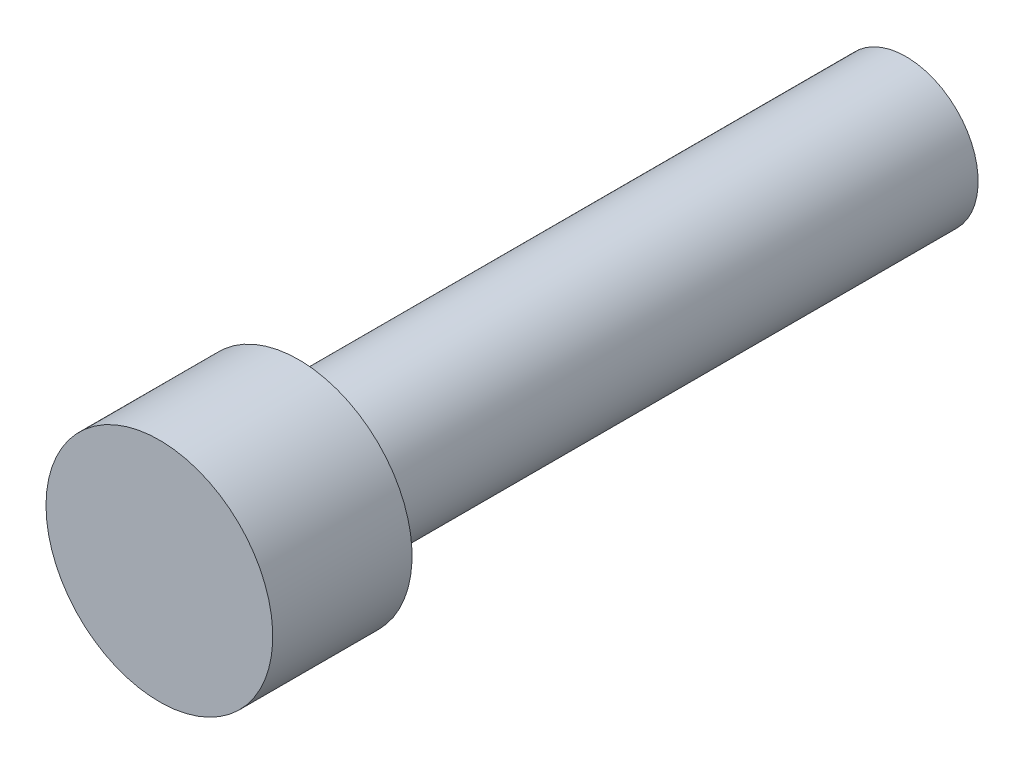
ISO-10303-21;
HEADER;
FILE_DESCRIPTION(('STEP AP214'),'2;1');
FILE_NAME('part.step','',(''),(''),'','','');
FILE_SCHEMA(('AUTOMOTIVE_DESIGN { 1 0 10303 214 1 1 1 1 }'));
ENDSEC;
DATA;
#1=APPLICATION_CONTEXT('core data for automotive mechanical design processes');
#2=APPLICATION_PROTOCOL_DEFINITION('international standard','automotive_design',2000,#1);
#3=PRODUCT_CONTEXT('',#1,'mechanical');
#4=PRODUCT('Part','Part','',(#3));
#5=PRODUCT_RELATED_PRODUCT_CATEGORY('part','',(#4));
#6=PRODUCT_DEFINITION_FORMATION('','',#4);
#7=PRODUCT_DEFINITION_CONTEXT('part definition',#1,'design');
#8=PRODUCT_DEFINITION('design','',#6,#7);
#9=PRODUCT_DEFINITION_SHAPE('','',#8);
#10=(LENGTH_UNIT() NAMED_UNIT(*) SI_UNIT(.MILLI.,.METRE.));
#11=(NAMED_UNIT(*) PLANE_ANGLE_UNIT() SI_UNIT($,.RADIAN.));
#12=(NAMED_UNIT(*) SI_UNIT($,.STERADIAN.) SOLID_ANGLE_UNIT());
#13=UNCERTAINTY_MEASURE_WITH_UNIT(LENGTH_MEASURE(1.E-05),#10,'distance_accuracy_value','');
#14=(GEOMETRIC_REPRESENTATION_CONTEXT(3) GLOBAL_UNCERTAINTY_ASSIGNED_CONTEXT((#13)) GLOBAL_UNIT_ASSIGNED_CONTEXT((#10,
#11,#12)) REPRESENTATION_CONTEXT('',''));
#15=CARTESIAN_POINT('',(0.,0.,0.));
#16=DIRECTION('',(0.,0.,1.));
#17=DIRECTION('',(1.,0.,0.));
#18=AXIS2_PLACEMENT_3D('',#15,#16,#17);
#19=CARTESIAN_POINT('',(0.,0.,11.7094));
#20=DIRECTION('',(0.,0.,-1.));
#21=DIRECTION('',(-1.,0.,0.));
#22=AXIS2_PLACEMENT_3D('',#19,#20,#21);
#23=CYLINDRICAL_SURFACE('',#22,1.778);
#24=CARTESIAN_POINT('',(0.,0.,11.7094));
#25=DIRECTION('',(0.,0.,1.));
#26=DIRECTION('',(1.,0.,0.));
#27=AXIS2_PLACEMENT_3D('',#24,#25,#26);
#28=CIRCLE('',#27,1.778);
#29=CARTESIAN_POINT('',(-1.778,0.,11.7094));
#30=VERTEX_POINT('',#29);
#31=EDGE_CURVE('E11',#30,#30,#28,.T.);
#32=CARTESIAN_POINT('',(0.,0.,9.525));
#33=DIRECTION('',(0.,0.,-1.));
#34=DIRECTION('',(-1.,0.,0.));
#35=AXIS2_PLACEMENT_3D('',#32,#33,#34);
#36=CIRCLE('',#35,1.778);
#37=CARTESIAN_POINT('',(-1.778,0.,9.525));
#38=VERTEX_POINT('',#37);
#39=EDGE_CURVE('E32',#38,#38,#36,.T.);
#40=CARTESIAN_POINT('',(-1.778,0.,11.7094));
#41=CARTESIAN_POINT('',(-1.778,0.,11.6866458333333));
#42=CARTESIAN_POINT('',(-1.778,0.,11.6638916666667));
#43=CARTESIAN_POINT('',(-1.778,0.,11.6183833333333));
#44=CARTESIAN_POINT('',(-1.778,0.,11.5956291666667));
#45=CARTESIAN_POINT('',(-1.778,0.,11.5501208333333));
#46=CARTESIAN_POINT('',(-1.778,0.,11.5273666666667));
#47=CARTESIAN_POINT('',(-1.778,0.,11.4818583333333));
#48=CARTESIAN_POINT('',(-1.778,0.,11.4591041666667));
#49=CARTESIAN_POINT('',(-1.778,0.,11.4135958333333));
#50=CARTESIAN_POINT('',(-1.778,0.,11.3908416666667));
#51=CARTESIAN_POINT('',(-1.778,0.,11.3453333333333));
#52=CARTESIAN_POINT('',(-1.778,0.,11.3225791666667));
#53=CARTESIAN_POINT('',(-1.778,0.,11.2770708333333));
#54=CARTESIAN_POINT('',(-1.778,0.,11.2543166666667));
#55=CARTESIAN_POINT('',(-1.778,0.,11.2088083333333));
#56=CARTESIAN_POINT('',(-1.778,0.,11.1860541666667));
#57=CARTESIAN_POINT('',(-1.778,0.,11.1405458333333));
#58=CARTESIAN_POINT('',(-1.778,0.,11.1177916666667));
#59=CARTESIAN_POINT('',(-1.778,0.,11.0722833333333));
#60=CARTESIAN_POINT('',(-1.778,0.,11.0495291666667));
#61=CARTESIAN_POINT('',(-1.778,0.,11.0040208333333));
#62=CARTESIAN_POINT('',(-1.778,0.,10.9812666666667));
#63=CARTESIAN_POINT('',(-1.778,0.,10.9357583333333));
#64=CARTESIAN_POINT('',(-1.778,0.,10.9130041666667));
#65=CARTESIAN_POINT('',(-1.778,0.,10.8674958333333));
#66=CARTESIAN_POINT('',(-1.778,0.,10.8447416666667));
#67=CARTESIAN_POINT('',(-1.778,0.,10.7992333333333));
#68=CARTESIAN_POINT('',(-1.778,0.,10.7764791666667));
#69=CARTESIAN_POINT('',(-1.778,0.,10.7309708333333));
#70=CARTESIAN_POINT('',(-1.778,0.,10.7082166666667));
#71=CARTESIAN_POINT('',(-1.778,0.,10.6627083333333));
#72=CARTESIAN_POINT('',(-1.778,0.,10.6399541666667));
#73=CARTESIAN_POINT('',(-1.778,0.,10.5944458333333));
#74=CARTESIAN_POINT('',(-1.778,0.,10.5716916666667));
#75=CARTESIAN_POINT('',(-1.778,0.,10.5261833333333));
#76=CARTESIAN_POINT('',(-1.778,0.,10.5034291666667));
#77=CARTESIAN_POINT('',(-1.778,0.,10.4579208333333));
#78=CARTESIAN_POINT('',(-1.778,0.,10.4351666666667));
#79=CARTESIAN_POINT('',(-1.778,0.,10.3896583333333));
#80=CARTESIAN_POINT('',(-1.778,0.,10.3669041666667));
#81=CARTESIAN_POINT('',(-1.778,0.,10.3213958333333));
#82=CARTESIAN_POINT('',(-1.778,0.,10.2986416666667));
#83=CARTESIAN_POINT('',(-1.778,0.,10.2531333333333));
#84=CARTESIAN_POINT('',(-1.778,0.,10.2303791666667));
#85=CARTESIAN_POINT('',(-1.778,0.,10.1848708333333));
#86=CARTESIAN_POINT('',(-1.778,0.,10.1621166666667));
#87=CARTESIAN_POINT('',(-1.778,0.,10.1166083333333));
#88=CARTESIAN_POINT('',(-1.778,0.,10.0938541666667));
#89=CARTESIAN_POINT('',(-1.778,0.,10.0483458333333));
#90=CARTESIAN_POINT('',(-1.778,0.,10.0255916666667));
#91=CARTESIAN_POINT('',(-1.778,0.,9.98008333333333));
#92=CARTESIAN_POINT('',(-1.778,0.,9.95732916666667));
#93=CARTESIAN_POINT('',(-1.778,0.,9.91182083333334));
#94=CARTESIAN_POINT('',(-1.778,0.,9.88906666666667));
#95=CARTESIAN_POINT('',(-1.778,0.,9.84355833333333));
#96=CARTESIAN_POINT('',(-1.778,0.,9.82080416666667));
#97=CARTESIAN_POINT('',(-1.778,0.,9.77529583333333));
#98=CARTESIAN_POINT('',(-1.778,0.,9.75254166666667));
#99=CARTESIAN_POINT('',(-1.778,0.,9.70703333333333));
#100=CARTESIAN_POINT('',(-1.778,0.,9.68427916666667));
#101=CARTESIAN_POINT('',(-1.778,0.,9.63877083333333));
#102=CARTESIAN_POINT('',(-1.778,0.,9.61601666666667));
#103=CARTESIAN_POINT('',(-1.778,0.,9.57050833333333));
#104=CARTESIAN_POINT('',(-1.778,0.,9.54775416666667));
#105=CARTESIAN_POINT('',(-1.778,0.,9.525));
#106=B_SPLINE_CURVE_WITH_KNOTS('',3,(#40,#41,#42,#43,#44,#45,#46,#47,#48,#49,#50,#51,#52,#53,
#54,#55,#56,#57,#58,#59,#60,#61,#62,#63,#64,#65,#66,#67,#68,#69,#70,#71,#72,#73,#74,#75,#76,#77,
#78,#79,#80,#81,#82,#83,#84,#85,#86,#87,#88,#89,#90,#91,#92,#93,#94,#95,#96,#97,#98,#99,#100,
#101,#102,#103,#104,#105),.UNSPECIFIED.,.F.,.F.,(4,2,2,2,2,2,2,2,2,2,2,2,2,2,2,2,2,2,2,2,2,2,2,
2,2,2,2,2,2,2,2,2,4),(0.,0.0682624999999992,0.136524999999998,0.204787499999999,
0.273049999999999,0.341312499999998,0.409574999999999,0.477837499999998,0.546099999999999,
0.614362499999998,0.682624999999997,0.750887499999998,0.819149999999998,0.887412499999999,
0.955674999999998,1.0239375,1.0922,1.1604625,1.228725,1.2969875,1.36525,1.4335125,1.501775,
1.5700375,1.6383,1.7065625,1.774825,1.8430875,1.91135,1.9796125,2.047875,2.11613749999999,
2.1844),.UNSPECIFIED.);
#107=EDGE_CURVE('BSEAM29',#30,#38,#106,.T.);
#108=ORIENTED_EDGE('',*,*,#31,.F.);
#109=ORIENTED_EDGE('',*,*,#39,.F.);
#110=ORIENTED_EDGE('',*,*,#107,.T.);
#111=ORIENTED_EDGE('',*,*,#107,.F.);
#112=EDGE_LOOP('',(#108,#110,#109,#111));
#113=FACE_BOUND('',#112,.T.);
#114=ADVANCED_FACE('F29',(#113),#23,.T.);
#115=CARTESIAN_POINT('',(0.,0.,11.7094));
#116=DIRECTION('',(0.,0.,1.));
#117=DIRECTION('',(1.,0.,0.));
#118=AXIS2_PLACEMENT_3D('',#115,#116,#117);
#119=PLANE('',#118);
#120=ORIENTED_EDGE('',*,*,#31,.T.);
#121=EDGE_LOOP('',(#120));
#122=FACE_BOUND('',#121,.T.);
#123=ADVANCED_FACE('F53',(#122),#119,.T.);
#124=CARTESIAN_POINT('',(0.,0.,9.525));
#125=DIRECTION('',(0.,0.,-1.));
#126=DIRECTION('',(-1.,0.,0.));
#127=AXIS2_PLACEMENT_3D('',#124,#125,#126);
#128=PLANE('',#127);
#129=CARTESIAN_POINT('',(0.,0.,9.525));
#130=DIRECTION('',(0.,0.,-1.));
#131=DIRECTION('',(-1.,0.,0.));
#132=AXIS2_PLACEMENT_3D('',#129,#130,#131);
#133=CIRCLE('',#132,1.1303);
#134=CARTESIAN_POINT('',(-1.1303,0.,9.525));
#135=VERTEX_POINT('',#134);
#136=EDGE_CURVE('E39',#135,#135,#133,.T.);
#137=ORIENTED_EDGE('',*,*,#136,.F.);
#138=EDGE_LOOP('',(#137));
#139=FACE_BOUND('',#138,.T.);
#140=ORIENTED_EDGE('',*,*,#39,.T.);
#141=EDGE_LOOP('',(#140));
#142=FACE_BOUND('',#141,.T.);
#143=ADVANCED_FACE('F50',(#139,#142),#128,.T.);
#144=CARTESIAN_POINT('',(0.,0.,9.525));
#145=DIRECTION('',(0.,0.,-1.));
#146=DIRECTION('',(-1.,0.,0.));
#147=AXIS2_PLACEMENT_3D('',#144,#145,#146);
#148=CYLINDRICAL_SURFACE('',#147,1.1303);
#149=CARTESIAN_POINT('',(0.,0.,0.));
#150=DIRECTION('',(0.,0.,-1.));
#151=DIRECTION('',(-1.,0.,0.));
#152=AXIS2_PLACEMENT_3D('',#149,#150,#151);
#153=CIRCLE('',#152,1.1303);
#154=CARTESIAN_POINT('',(-1.1303,0.,0.));
#155=VERTEX_POINT('',#154);
#156=EDGE_CURVE('E41',#155,#155,#153,.T.);
#157=CARTESIAN_POINT('',(-1.1303,0.,9.525));
#158=CARTESIAN_POINT('',(-1.1303,0.,9.42578125));
#159=CARTESIAN_POINT('',(-1.1303,0.,9.3265625));
#160=CARTESIAN_POINT('',(-1.1303,0.,9.128125));
#161=CARTESIAN_POINT('',(-1.1303,0.,9.02890625));
#162=CARTESIAN_POINT('',(-1.1303,0.,8.83046875));
#163=CARTESIAN_POINT('',(-1.1303,0.,8.73125));
#164=CARTESIAN_POINT('',(-1.1303,0.,8.5328125));
#165=CARTESIAN_POINT('',(-1.1303,0.,8.43359375));
#166=CARTESIAN_POINT('',(-1.1303,0.,8.23515625));
#167=CARTESIAN_POINT('',(-1.1303,0.,8.1359375));
#168=CARTESIAN_POINT('',(-1.1303,0.,7.9375));
#169=CARTESIAN_POINT('',(-1.1303,0.,7.83828125));
#170=CARTESIAN_POINT('',(-1.1303,0.,7.63984375));
#171=CARTESIAN_POINT('',(-1.1303,0.,7.540625));
#172=CARTESIAN_POINT('',(-1.1303,0.,7.3421875));
#173=CARTESIAN_POINT('',(-1.1303,0.,7.24296875));
#174=CARTESIAN_POINT('',(-1.1303,0.,7.04453125));
#175=CARTESIAN_POINT('',(-1.1303,0.,6.9453125));
#176=CARTESIAN_POINT('',(-1.1303,0.,6.746875));
#177=CARTESIAN_POINT('',(-1.1303,0.,6.64765625));
#178=CARTESIAN_POINT('',(-1.1303,0.,6.44921875));
#179=CARTESIAN_POINT('',(-1.1303,0.,6.35));
#180=CARTESIAN_POINT('',(-1.1303,0.,6.1515625));
#181=CARTESIAN_POINT('',(-1.1303,0.,6.05234375));
#182=CARTESIAN_POINT('',(-1.1303,0.,5.85390625));
#183=CARTESIAN_POINT('',(-1.1303,0.,5.7546875));
#184=CARTESIAN_POINT('',(-1.1303,0.,5.55625));
#185=CARTESIAN_POINT('',(-1.1303,0.,5.45703125));
#186=CARTESIAN_POINT('',(-1.1303,0.,5.25859375));
#187=CARTESIAN_POINT('',(-1.1303,0.,5.159375));
#188=CARTESIAN_POINT('',(-1.1303,0.,4.9609375));
#189=CARTESIAN_POINT('',(-1.1303,0.,4.86171875));
#190=CARTESIAN_POINT('',(-1.1303,0.,4.66328125));
#191=CARTESIAN_POINT('',(-1.1303,0.,4.5640625));
#192=CARTESIAN_POINT('',(-1.1303,0.,4.365625));
#193=CARTESIAN_POINT('',(-1.1303,0.,4.26640625));
#194=CARTESIAN_POINT('',(-1.1303,0.,4.06796875));
#195=CARTESIAN_POINT('',(-1.1303,0.,3.96875));
#196=CARTESIAN_POINT('',(-1.1303,0.,3.7703125));
#197=CARTESIAN_POINT('',(-1.1303,0.,3.67109375));
#198=CARTESIAN_POINT('',(-1.1303,0.,3.47265625));
#199=CARTESIAN_POINT('',(-1.1303,0.,3.3734375));
#200=CARTESIAN_POINT('',(-1.1303,0.,3.175));
#201=CARTESIAN_POINT('',(-1.1303,0.,3.07578125));
#202=CARTESIAN_POINT('',(-1.1303,0.,2.87734375));
#203=CARTESIAN_POINT('',(-1.1303,0.,2.778125));
#204=CARTESIAN_POINT('',(-1.1303,0.,2.5796875));
#205=CARTESIAN_POINT('',(-1.1303,0.,2.48046875));
#206=CARTESIAN_POINT('',(-1.1303,0.,2.28203125));
#207=CARTESIAN_POINT('',(-1.1303,0.,2.1828125));
#208=CARTESIAN_POINT('',(-1.1303,0.,1.984375));
#209=CARTESIAN_POINT('',(-1.1303,0.,1.88515625));
#210=CARTESIAN_POINT('',(-1.1303,0.,1.68671875));
#211=CARTESIAN_POINT('',(-1.1303,0.,1.5875));
#212=CARTESIAN_POINT('',(-1.1303,0.,1.3890625));
#213=CARTESIAN_POINT('',(-1.1303,0.,1.28984375));
#214=CARTESIAN_POINT('',(-1.1303,0.,1.09140625));
#215=CARTESIAN_POINT('',(-1.1303,0.,0.992187500000001));
#216=CARTESIAN_POINT('',(-1.1303,0.,0.793750000000001));
#217=CARTESIAN_POINT('',(-1.1303,0.,0.69453125));
#218=CARTESIAN_POINT('',(-1.1303,0.,0.49609375));
#219=CARTESIAN_POINT('',(-1.1303,0.,0.396875));
#220=CARTESIAN_POINT('',(-1.1303,0.,0.1984375));
#221=CARTESIAN_POINT('',(-1.1303,0.,0.0992187500000001));
#222=CARTESIAN_POINT('',(-1.1303,0.,0.));
#223=B_SPLINE_CURVE_WITH_KNOTS('',3,(#157,#158,#159,#160,#161,#162,#163,#164,#165,#166,#167,
#168,#169,#170,#171,#172,#173,#174,#175,#176,#177,#178,#179,#180,#181,#182,#183,#184,#185,#186,
#187,#188,#189,#190,#191,#192,#193,#194,#195,#196,#197,#198,#199,#200,#201,#202,#203,#204,#205,
#206,#207,#208,#209,#210,#211,#212,#213,#214,#215,#216,#217,#218,#219,#220,#221,#222),
.UNSPECIFIED.,.F.,.F.,(4,2,2,2,2,2,2,2,2,2,2,2,2,2,2,2,2,2,2,2,2,2,2,2,2,2,2,2,2,2,2,2,4),(0.,
0.29765625,0.5953125,0.892968750000001,1.190625,1.48828125,1.7859375,2.08359375,2.38125,
2.67890625,2.9765625,3.27421875,3.571875,3.86953125,4.1671875,4.46484375,4.7625,5.06015625,
5.3578125,5.65546875,5.953125,6.25078125,6.5484375,6.84609375,7.14375,7.44140625,7.7390625,
8.03671875,8.334375,8.63203125,8.9296875,9.22734375,9.525),.UNSPECIFIED.);
#224=EDGE_CURVE('BSEAM47',#135,#155,#223,.T.);
#225=ORIENTED_EDGE('',*,*,#136,.T.);
#226=ORIENTED_EDGE('',*,*,#156,.F.);
#227=ORIENTED_EDGE('',*,*,#224,.T.);
#228=ORIENTED_EDGE('',*,*,#224,.F.);
#229=EDGE_LOOP('',(#225,#227,#226,#228));
#230=FACE_BOUND('',#229,.T.);
#231=ADVANCED_FACE('F47',(#230),#148,.T.);
#232=CARTESIAN_POINT('',(0.,0.,0.));
#233=DIRECTION('',(0.,0.,1.));
#234=DIRECTION('',(1.,0.,0.));
#235=AXIS2_PLACEMENT_3D('',#232,#233,#234);
#236=PLANE('',#235);
#237=ORIENTED_EDGE('',*,*,#156,.T.);
#238=EDGE_LOOP('',(#237));
#239=FACE_BOUND('',#238,.T.);
#240=ADVANCED_FACE('F66',(#239),#236,.F.);
#241=CLOSED_SHELL('',(#114,#123,#143,#231,#240));
#242=MANIFOLD_SOLID_BREP('B2',#241);
#243=ADVANCED_BREP_SHAPE_REPRESENTATION('',(#18,#242),#14);
#244=SHAPE_DEFINITION_REPRESENTATION(#9,#243);
ENDSEC;
END-ISO-10303-21;
